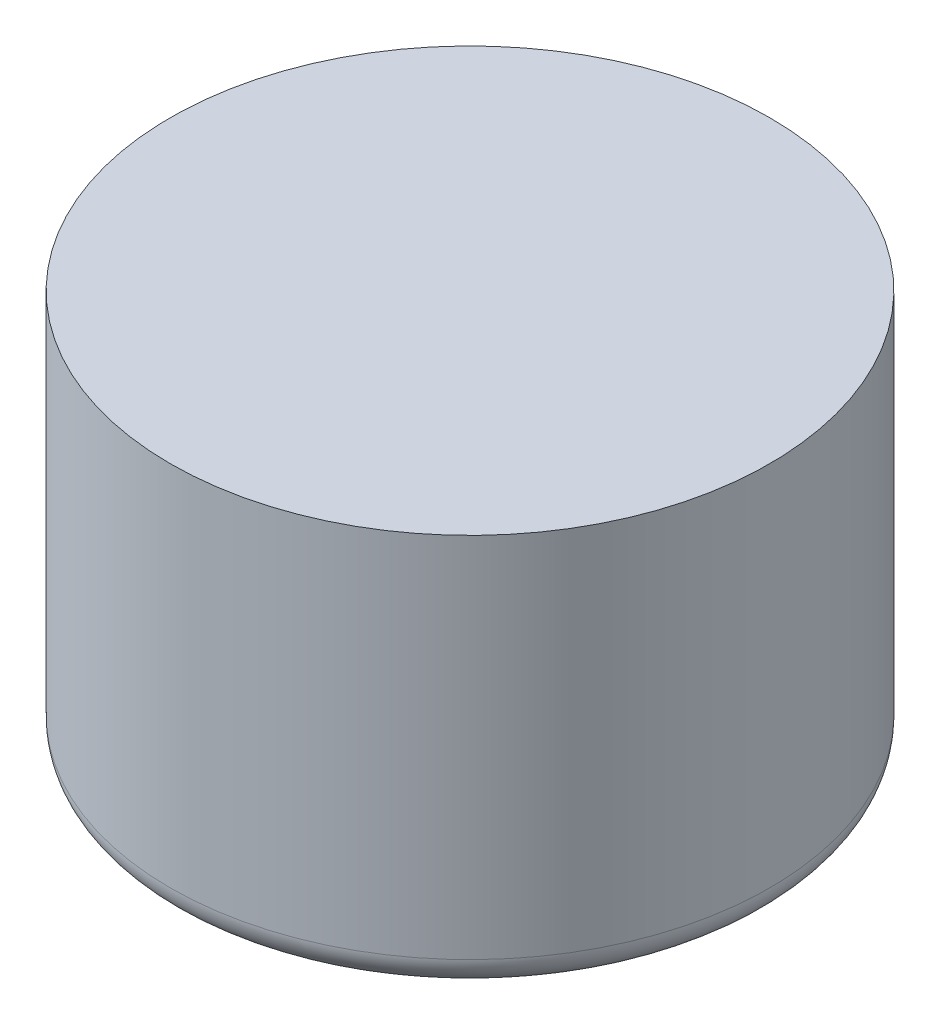
ISO-10303-21;
HEADER;
FILE_DESCRIPTION(('STEP AP214'),'2;1');
FILE_NAME('part.step','',(''),(''),'','','');
FILE_SCHEMA(('AUTOMOTIVE_DESIGN { 1 0 10303 214 1 1 1 1 }'));
ENDSEC;
DATA;
#1=APPLICATION_CONTEXT('core data for automotive mechanical design processes');
#2=APPLICATION_PROTOCOL_DEFINITION('international standard','automotive_design',2000,#1);
#3=PRODUCT_CONTEXT('',#1,'mechanical');
#4=PRODUCT('Part','Part','',(#3));
#5=PRODUCT_RELATED_PRODUCT_CATEGORY('part','',(#4));
#6=PRODUCT_DEFINITION_FORMATION('','',#4);
#7=PRODUCT_DEFINITION_CONTEXT('part definition',#1,'design');
#8=PRODUCT_DEFINITION('design','',#6,#7);
#9=PRODUCT_DEFINITION_SHAPE('','',#8);
#10=(LENGTH_UNIT() NAMED_UNIT(*) SI_UNIT(.MILLI.,.METRE.));
#11=(NAMED_UNIT(*) PLANE_ANGLE_UNIT() SI_UNIT($,.RADIAN.));
#12=(NAMED_UNIT(*) SI_UNIT($,.STERADIAN.) SOLID_ANGLE_UNIT());
#13=UNCERTAINTY_MEASURE_WITH_UNIT(LENGTH_MEASURE(1.E-05),#10,'distance_accuracy_value','');
#14=(GEOMETRIC_REPRESENTATION_CONTEXT(3) GLOBAL_UNCERTAINTY_ASSIGNED_CONTEXT((#13)) GLOBAL_UNIT_ASSIGNED_CONTEXT((#10,
#11,#12)) REPRESENTATION_CONTEXT('',''));
#15=CARTESIAN_POINT('',(0.,0.,0.));
#16=DIRECTION('',(0.,0.,1.));
#17=DIRECTION('',(1.,0.,0.));
#18=AXIS2_PLACEMENT_3D('',#15,#16,#17);
#19=CARTESIAN_POINT('',(0.,-55.,0.));
#20=DIRECTION('',(0.,-1.,0.));
#21=DIRECTION('',(0.,0.,-1.));
#22=AXIS2_PLACEMENT_3D('',#19,#20,#21);
#23=CYLINDRICAL_SURFACE('',#22,24.27678);
#24=CARTESIAN_POINT('',(0.,2.5,0.));
#25=DIRECTION('',(0.,-1.,0.));
#26=DIRECTION('',(0.,0.,-1.));
#27=AXIS2_PLACEMENT_3D('',#24,#25,#26);
#28=CIRCLE('',#27,24.27678);
#29=CARTESIAN_POINT('',(0.,2.5,-24.27678));
#30=VERTEX_POINT('',#29);
#31=EDGE_CURVE('E10',#30,#30,#28,.T.);
#32=ORIENTED_EDGE('',*,*,#31,.F.);
#33=EDGE_LOOP('',(#32));
#34=FACE_BOUND('',#33,.T.);
#35=CARTESIAN_POINT('',(0.,32.258,0.));
#36=DIRECTION('',(0.,-1.,0.));
#37=DIRECTION('',(0.,0.,-1.));
#38=AXIS2_PLACEMENT_3D('',#35,#36,#37);
#39=CIRCLE('',#38,24.27678);
#40=CARTESIAN_POINT('',(0.,32.258,-24.27678));
#41=VERTEX_POINT('',#40);
#42=EDGE_CURVE('E44',#41,#41,#39,.T.);
#43=ORIENTED_EDGE('',*,*,#42,.T.);
#44=EDGE_LOOP('',(#43));
#45=FACE_BOUND('',#44,.T.);
#46=ADVANCED_FACE('F34',(#34,#45),#23,.T.);
#47=CARTESIAN_POINT('',(0.,2.5,0.));
#48=DIRECTION('',(0.,-1.,0.));
#49=DIRECTION('',(0.,0.,-1.));
#50=AXIS2_PLACEMENT_3D('',#47,#48,#49);
#51=TOROIDAL_SURFACE('',#50,21.77678,2.5);
#52=CARTESIAN_POINT('',(0.,0.,0.));
#53=DIRECTION('',(0.,-1.,0.));
#54=DIRECTION('',(0.,0.,-1.));
#55=AXIS2_PLACEMENT_3D('',#52,#53,#54);
#56=CIRCLE('',#55,21.77678);
#57=CARTESIAN_POINT('',(0.,0.,-21.77678));
#58=VERTEX_POINT('',#57);
#59=EDGE_CURVE('E40',#58,#58,#56,.T.);
#60=ORIENTED_EDGE('',*,*,#59,.F.);
#61=EDGE_LOOP('',(#60));
#62=FACE_BOUND('',#61,.T.);
#63=ORIENTED_EDGE('',*,*,#31,.T.);
#64=EDGE_LOOP('',(#63));
#65=FACE_BOUND('',#64,.T.);
#66=ADVANCED_FACE('F59',(#62,#65),#51,.T.);
#67=CARTESIAN_POINT('',(-21.77678,0.,0.));
#68=DIRECTION('',(0.,1.,0.));
#69=DIRECTION('',(0.,0.,1.));
#70=AXIS2_PLACEMENT_3D('',#67,#68,#69);
#71=PLANE('',#70);
#72=ORIENTED_EDGE('',*,*,#59,.T.);
#73=EDGE_LOOP('',(#72));
#74=FACE_BOUND('',#73,.T.);
#75=ADVANCED_FACE('F54',(#74),#71,.F.);
#76=CARTESIAN_POINT('',(-24.27678,32.258,0.));
#77=DIRECTION('',(0.,-1.,0.));
#78=DIRECTION('',(0.,0.,-1.));
#79=AXIS2_PLACEMENT_3D('',#76,#77,#78);
#80=PLANE('',#79);
#81=ORIENTED_EDGE('',*,*,#42,.F.);
#82=EDGE_LOOP('',(#81));
#83=FACE_BOUND('',#82,.T.);
#84=ADVANCED_FACE('F52',(#83),#80,.F.);
#85=CLOSED_SHELL('',(#46,#66,#75,#84));
#86=MANIFOLD_SOLID_BREP('B2',#85);
#87=ADVANCED_BREP_SHAPE_REPRESENTATION('',(#18,#86),#14);
#88=SHAPE_DEFINITION_REPRESENTATION(#9,#87);
ENDSEC;
END-ISO-10303-21;
